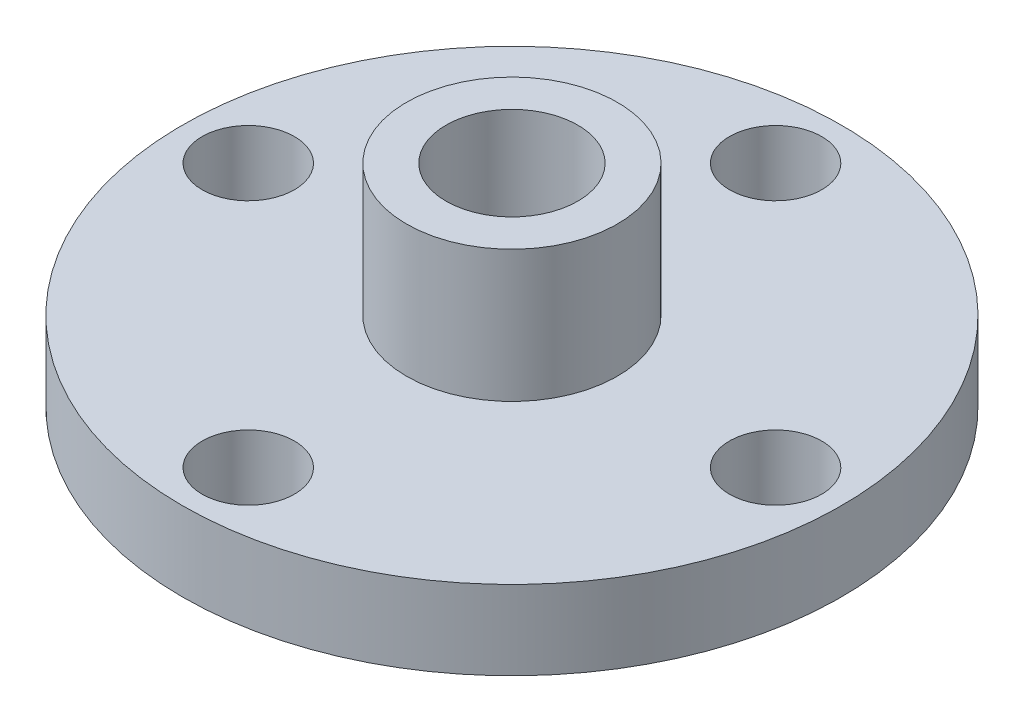
ISO-10303-21;
HEADER;
FILE_DESCRIPTION(('STEP AP214'),'2;1');
FILE_NAME('part.step','',(''),(''),'','','');
FILE_SCHEMA(('AUTOMOTIVE_DESIGN { 1 0 10303 214 1 1 1 1 }'));
ENDSEC;
DATA;
#1=APPLICATION_CONTEXT('core data for automotive mechanical design processes');
#2=APPLICATION_PROTOCOL_DEFINITION('international standard','automotive_design',2000,#1);
#3=PRODUCT_CONTEXT('',#1,'mechanical');
#4=PRODUCT('Part','Part','',(#3));
#5=PRODUCT_RELATED_PRODUCT_CATEGORY('part','',(#4));
#6=PRODUCT_DEFINITION_FORMATION('','',#4);
#7=PRODUCT_DEFINITION_CONTEXT('part definition',#1,'design');
#8=PRODUCT_DEFINITION('design','',#6,#7);
#9=PRODUCT_DEFINITION_SHAPE('','',#8);
#10=(LENGTH_UNIT() NAMED_UNIT(*) SI_UNIT(.MILLI.,.METRE.));
#11=(NAMED_UNIT(*) PLANE_ANGLE_UNIT() SI_UNIT($,.RADIAN.));
#12=(NAMED_UNIT(*) SI_UNIT($,.STERADIAN.) SOLID_ANGLE_UNIT());
#13=UNCERTAINTY_MEASURE_WITH_UNIT(LENGTH_MEASURE(1.E-05),#10,'distance_accuracy_value','');
#14=(GEOMETRIC_REPRESENTATION_CONTEXT(3) GLOBAL_UNCERTAINTY_ASSIGNED_CONTEXT((#13)) GLOBAL_UNIT_ASSIGNED_CONTEXT((#10,
#11,#12)) REPRESENTATION_CONTEXT('',''));
#15=CARTESIAN_POINT('',(0.,0.,0.));
#16=DIRECTION('',(0.,0.,1.));
#17=DIRECTION('',(1.,0.,0.));
#18=AXIS2_PLACEMENT_3D('',#15,#16,#17);
#19=CARTESIAN_POINT('',(0.,3.,0.));
#20=DIRECTION('',(0.,1.,0.));
#21=DIRECTION('',(0.,0.,1.));
#22=AXIS2_PLACEMENT_3D('',#19,#20,#21);
#23=PLANE('',#22);
#24=CARTESIAN_POINT('',(-9.99999999999972,3.,2.83604770904466E-13));
#25=DIRECTION('',(0.,1.,0.));
#26=DIRECTION('',(0.,0.,1.));
#27=AXIS2_PLACEMENT_3D('',#24,#25,#26);
#28=CIRCLE('',#27,1.75000000000045);
#29=CARTESIAN_POINT('',(-9.99999999999972,3.,1.75000000000074));
#30=VERTEX_POINT('',#29);
#31=EDGE_CURVE('E76',#30,#30,#28,.T.);
#32=ORIENTED_EDGE('',*,*,#31,.F.);
#33=EDGE_LOOP('',(#32));
#34=FACE_BOUND('',#33,.T.);
#35=CARTESIAN_POINT('',(10.0000000000003,3.,-2.82380124105319E-13));
#36=DIRECTION('',(0.,1.,0.));
#37=DIRECTION('',(0.,0.,1.));
#38=AXIS2_PLACEMENT_3D('',#35,#36,#37);
#39=CIRCLE('',#38,1.75000000000022);
#40=CARTESIAN_POINT('',(10.0000000000003,3.,1.74999999999994));
#41=VERTEX_POINT('',#40);
#42=EDGE_CURVE('E60',#41,#41,#39,.T.);
#43=ORIENTED_EDGE('',*,*,#42,.F.);
#44=EDGE_LOOP('',(#43));
#45=FACE_BOUND('',#44,.T.);
#46=CARTESIAN_POINT('',(0.,3.,0.));
#47=DIRECTION('',(0.,1.,0.));
#48=DIRECTION('',(0.,0.,1.));
#49=AXIS2_PLACEMENT_3D('',#46,#47,#48);
#50=CIRCLE('',#49,12.5);
#51=CARTESIAN_POINT('',(0.,3.,12.5));
#52=VERTEX_POINT('',#51);
#53=EDGE_CURVE('E10',#52,#52,#50,.T.);
#54=ORIENTED_EDGE('',*,*,#53,.T.);
#55=EDGE_LOOP('',(#54));
#56=FACE_BOUND('',#55,.T.);
#57=CARTESIAN_POINT('',(0.,3.,-10.));
#58=DIRECTION('',(0.,1.,0.));
#59=DIRECTION('',(0.,0.,1.));
#60=AXIS2_PLACEMENT_3D('',#57,#58,#59);
#61=CIRCLE('',#60,1.75);
#62=CARTESIAN_POINT('',(0.,3.,-8.25));
#63=VERTEX_POINT('',#62);
#64=EDGE_CURVE('E55',#63,#63,#61,.T.);
#65=ORIENTED_EDGE('',*,*,#64,.F.);
#66=EDGE_LOOP('',(#65));
#67=FACE_BOUND('',#66,.T.);
#68=CARTESIAN_POINT('',(5.64760248210638E-13,3.,10.));
#69=DIRECTION('',(0.,1.,0.));
#70=DIRECTION('',(0.,0.,1.));
#71=AXIS2_PLACEMENT_3D('',#68,#69,#70);
#72=CIRCLE('',#71,1.75000000000061);
#73=CARTESIAN_POINT('',(5.64760248210638E-13,3.,11.7500000000006));
#74=VERTEX_POINT('',#73);
#75=EDGE_CURVE('E68',#74,#74,#72,.T.);
#76=ORIENTED_EDGE('',*,*,#75,.F.);
#77=EDGE_LOOP('',(#76));
#78=FACE_BOUND('',#77,.T.);
#79=CARTESIAN_POINT('',(0.,3.,0.));
#80=DIRECTION('',(0.,1.,0.));
#81=DIRECTION('',(0.,0.,1.));
#82=AXIS2_PLACEMENT_3D('',#79,#80,#81);
#83=CIRCLE('',#82,4.);
#84=CARTESIAN_POINT('',(0.,3.,4.));
#85=VERTEX_POINT('',#84);
#86=EDGE_CURVE('E88',#85,#85,#83,.T.);
#87=ORIENTED_EDGE('',*,*,#86,.F.);
#88=EDGE_LOOP('',(#87));
#89=FACE_BOUND('',#88,.T.);
#90=ADVANCED_FACE('F37',(#34,#45,#56,#67,#78,#89),#23,.T.);
#91=CARTESIAN_POINT('',(0.,0.,0.));
#92=DIRECTION('',(0.,1.,0.));
#93=DIRECTION('',(0.,0.,1.));
#94=AXIS2_PLACEMENT_3D('',#91,#92,#93);
#95=PLANE('',#94);
#96=CARTESIAN_POINT('',(0.,0.,0.));
#97=DIRECTION('',(0.,1.,0.));
#98=DIRECTION('',(0.,0.,1.));
#99=AXIS2_PLACEMENT_3D('',#96,#97,#98);
#100=CIRCLE('',#99,12.5);
#101=CARTESIAN_POINT('',(0.,0.,12.5));
#102=VERTEX_POINT('',#101);
#103=EDGE_CURVE('E41',#102,#102,#100,.T.);
#104=ORIENTED_EDGE('',*,*,#103,.F.);
#105=EDGE_LOOP('',(#104));
#106=FACE_BOUND('',#105,.T.);
#107=CARTESIAN_POINT('',(0.,0.,0.));
#108=DIRECTION('',(0.,1.,0.));
#109=DIRECTION('',(0.,0.,1.));
#110=AXIS2_PLACEMENT_3D('',#107,#108,#109);
#111=CIRCLE('',#110,2.5);
#112=CARTESIAN_POINT('',(0.,0.,2.5));
#113=VERTEX_POINT('',#112);
#114=EDGE_CURVE('E50',#113,#113,#111,.T.);
#115=ORIENTED_EDGE('',*,*,#114,.T.);
#116=EDGE_LOOP('',(#115));
#117=FACE_BOUND('',#116,.T.);
#118=CARTESIAN_POINT('',(0.,0.,-10.));
#119=DIRECTION('',(0.,1.,0.));
#120=DIRECTION('',(0.,0.,1.));
#121=AXIS2_PLACEMENT_3D('',#118,#119,#120);
#122=CIRCLE('',#121,1.75);
#123=CARTESIAN_POINT('',(0.,0.,-8.25));
#124=VERTEX_POINT('',#123);
#125=EDGE_CURVE('E56',#124,#124,#122,.T.);
#126=ORIENTED_EDGE('',*,*,#125,.T.);
#127=EDGE_LOOP('',(#126));
#128=FACE_BOUND('',#127,.T.);
#129=CARTESIAN_POINT('',(10.0000000000003,0.,-2.82380124105319E-13));
#130=DIRECTION('',(0.,1.,0.));
#131=DIRECTION('',(0.,0.,1.));
#132=AXIS2_PLACEMENT_3D('',#129,#130,#131);
#133=CIRCLE('',#132,1.75000000000022);
#134=CARTESIAN_POINT('',(10.0000000000003,0.,1.74999999999994));
#135=VERTEX_POINT('',#134);
#136=EDGE_CURVE('E64',#135,#135,#133,.T.);
#137=ORIENTED_EDGE('',*,*,#136,.T.);
#138=EDGE_LOOP('',(#137));
#139=FACE_BOUND('',#138,.T.);
#140=CARTESIAN_POINT('',(5.64760248210638E-13,0.,10.));
#141=DIRECTION('',(0.,1.,0.));
#142=DIRECTION('',(0.,0.,1.));
#143=AXIS2_PLACEMENT_3D('',#140,#141,#142);
#144=CIRCLE('',#143,1.75000000000061);
#145=CARTESIAN_POINT('',(5.64760248210638E-13,0.,11.7500000000006));
#146=VERTEX_POINT('',#145);
#147=EDGE_CURVE('E72',#146,#146,#144,.T.);
#148=ORIENTED_EDGE('',*,*,#147,.T.);
#149=EDGE_LOOP('',(#148));
#150=FACE_BOUND('',#149,.T.);
#151=CARTESIAN_POINT('',(-9.99999999999972,0.,2.83604770904466E-13));
#152=DIRECTION('',(0.,1.,0.));
#153=DIRECTION('',(0.,0.,1.));
#154=AXIS2_PLACEMENT_3D('',#151,#152,#153);
#155=CIRCLE('',#154,1.75000000000045);
#156=CARTESIAN_POINT('',(-9.99999999999972,0.,1.75000000000074));
#157=VERTEX_POINT('',#156);
#158=EDGE_CURVE('E80',#157,#157,#155,.T.);
#159=ORIENTED_EDGE('',*,*,#158,.T.);
#160=EDGE_LOOP('',(#159));
#161=FACE_BOUND('',#160,.T.);
#162=ADVANCED_FACE('F118',(#106,#117,#128,#139,#150,#161),#95,.F.);
#163=CARTESIAN_POINT('',(0.,3.,0.));
#164=DIRECTION('',(0.,-1.,0.));
#165=DIRECTION('',(0.,0.,-1.));
#166=AXIS2_PLACEMENT_3D('',#163,#164,#165);
#167=CYLINDRICAL_SURFACE('',#166,12.5);
#168=ORIENTED_EDGE('',*,*,#53,.F.);
#169=EDGE_LOOP('',(#168));
#170=FACE_BOUND('',#169,.T.);
#171=ORIENTED_EDGE('',*,*,#103,.T.);
#172=EDGE_LOOP('',(#171));
#173=FACE_BOUND('',#172,.T.);
#174=ADVANCED_FACE('F39',(#170,#173),#167,.T.);
#175=CARTESIAN_POINT('',(0.,3.,0.));
#176=DIRECTION('',(0.,-1.,0.));
#177=DIRECTION('',(0.,0.,-1.));
#178=AXIS2_PLACEMENT_3D('',#175,#176,#177);
#179=CYLINDRICAL_SURFACE('',#178,2.5);
#180=ORIENTED_EDGE('',*,*,#114,.F.);
#181=EDGE_LOOP('',(#180));
#182=FACE_BOUND('',#181,.T.);
#183=CARTESIAN_POINT('',(0.,8.,0.));
#184=DIRECTION('',(0.,1.,0.));
#185=DIRECTION('',(0.,0.,1.));
#186=AXIS2_PLACEMENT_3D('',#183,#184,#185);
#187=CIRCLE('',#186,2.5);
#188=CARTESIAN_POINT('',(0.,8.,2.5));
#189=VERTEX_POINT('',#188);
#190=EDGE_CURVE('E92',#189,#189,#187,.T.);
#191=ORIENTED_EDGE('',*,*,#190,.T.);
#192=EDGE_LOOP('',(#191));
#193=FACE_BOUND('',#192,.T.);
#194=ADVANCED_FACE('F100',(#182,#193),#179,.F.);
#195=CARTESIAN_POINT('',(0.,3.,-10.));
#196=DIRECTION('',(0.,-1.,0.));
#197=DIRECTION('',(0.,0.,-1.));
#198=AXIS2_PLACEMENT_3D('',#195,#196,#197);
#199=CYLINDRICAL_SURFACE('',#198,1.75);
#200=ORIENTED_EDGE('',*,*,#64,.T.);
#201=EDGE_LOOP('',(#200));
#202=FACE_BOUND('',#201,.T.);
#203=ORIENTED_EDGE('',*,*,#125,.F.);
#204=EDGE_LOOP('',(#203));
#205=FACE_BOUND('',#204,.T.);
#206=ADVANCED_FACE('F130',(#202,#205),#199,.F.);
#207=CARTESIAN_POINT('',(10.0000000000003,3.,-2.82380124105319E-13));
#208=DIRECTION('',(0.,-1.,0.));
#209=DIRECTION('',(0.,0.,-1.));
#210=AXIS2_PLACEMENT_3D('',#207,#208,#209);
#211=CYLINDRICAL_SURFACE('',#210,1.75000000000022);
#212=ORIENTED_EDGE('',*,*,#42,.T.);
#213=EDGE_LOOP('',(#212));
#214=FACE_BOUND('',#213,.T.);
#215=ORIENTED_EDGE('',*,*,#136,.F.);
#216=EDGE_LOOP('',(#215));
#217=FACE_BOUND('',#216,.T.);
#218=ADVANCED_FACE('F134',(#214,#217),#211,.F.);
#219=CARTESIAN_POINT('',(5.64760248210638E-13,3.,10.));
#220=DIRECTION('',(0.,-1.,0.));
#221=DIRECTION('',(0.,0.,-1.));
#222=AXIS2_PLACEMENT_3D('',#219,#220,#221);
#223=CYLINDRICAL_SURFACE('',#222,1.75000000000061);
#224=ORIENTED_EDGE('',*,*,#75,.T.);
#225=EDGE_LOOP('',(#224));
#226=FACE_BOUND('',#225,.T.);
#227=ORIENTED_EDGE('',*,*,#147,.F.);
#228=EDGE_LOOP('',(#227));
#229=FACE_BOUND('',#228,.T.);
#230=ADVANCED_FACE('F114',(#226,#229),#223,.F.);
#231=CARTESIAN_POINT('',(-9.99999999999972,3.,2.83604770904466E-13));
#232=DIRECTION('',(0.,-1.,0.));
#233=DIRECTION('',(0.,0.,-1.));
#234=AXIS2_PLACEMENT_3D('',#231,#232,#233);
#235=CYLINDRICAL_SURFACE('',#234,1.75000000000045);
#236=ORIENTED_EDGE('',*,*,#31,.T.);
#237=EDGE_LOOP('',(#236));
#238=FACE_BOUND('',#237,.T.);
#239=ORIENTED_EDGE('',*,*,#158,.F.);
#240=EDGE_LOOP('',(#239));
#241=FACE_BOUND('',#240,.T.);
#242=ADVANCED_FACE('F105',(#238,#241),#235,.F.);
#243=CARTESIAN_POINT('',(0.,8.,0.));
#244=DIRECTION('',(0.,1.,0.));
#245=DIRECTION('',(0.,0.,1.));
#246=AXIS2_PLACEMENT_3D('',#243,#244,#245);
#247=PLANE('',#246);
#248=CARTESIAN_POINT('',(0.,8.,0.));
#249=DIRECTION('',(0.,1.,0.));
#250=DIRECTION('',(0.,0.,1.));
#251=AXIS2_PLACEMENT_3D('',#248,#249,#250);
#252=CIRCLE('',#251,4.);
#253=CARTESIAN_POINT('',(0.,8.,4.));
#254=VERTEX_POINT('',#253);
#255=EDGE_CURVE('E84',#254,#254,#252,.T.);
#256=ORIENTED_EDGE('',*,*,#255,.T.);
#257=EDGE_LOOP('',(#256));
#258=FACE_BOUND('',#257,.T.);
#259=ORIENTED_EDGE('',*,*,#190,.F.);
#260=EDGE_LOOP('',(#259));
#261=FACE_BOUND('',#260,.T.);
#262=ADVANCED_FACE('F102',(#258,#261),#247,.T.);
#263=CARTESIAN_POINT('',(0.,8.,0.));
#264=DIRECTION('',(0.,-1.,0.));
#265=DIRECTION('',(0.,0.,-1.));
#266=AXIS2_PLACEMENT_3D('',#263,#264,#265);
#267=CYLINDRICAL_SURFACE('',#266,4.);
#268=ORIENTED_EDGE('',*,*,#255,.F.);
#269=EDGE_LOOP('',(#268));
#270=FACE_BOUND('',#269,.T.);
#271=ORIENTED_EDGE('',*,*,#86,.T.);
#272=EDGE_LOOP('',(#271));
#273=FACE_BOUND('',#272,.T.);
#274=ADVANCED_FACE('F104',(#270,#273),#267,.T.);
#275=CLOSED_SHELL('',(#90,#162,#174,#194,#206,#218,#230,#242,#262,#274));
#276=MANIFOLD_SOLID_BREP('B2',#275);
#277=ADVANCED_BREP_SHAPE_REPRESENTATION('',(#18,#276),#14);
#278=SHAPE_DEFINITION_REPRESENTATION(#9,#277);
ENDSEC;
END-ISO-10303-21;
